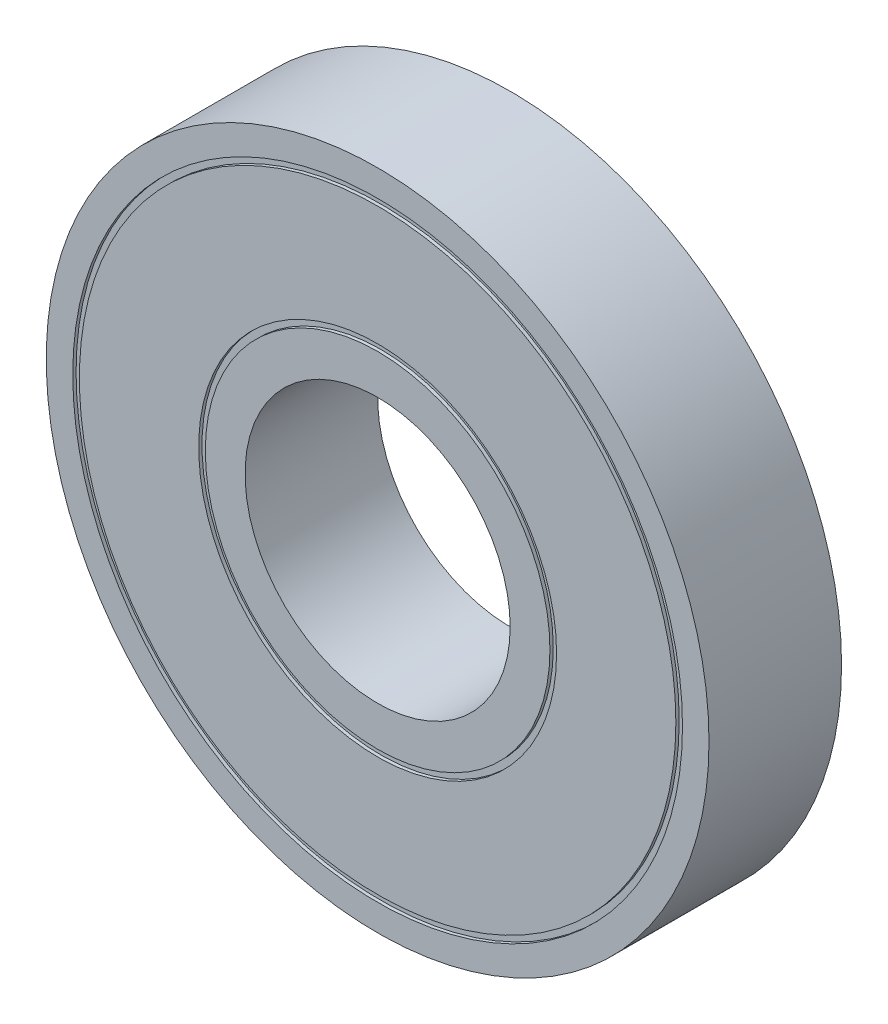
ISO-10303-21;
HEADER;
FILE_DESCRIPTION(('STEP AP214'),'2;1');
FILE_NAME('part.step','',(''),(''),'','','');
FILE_SCHEMA(('AUTOMOTIVE_DESIGN { 1 0 10303 214 1 1 1 1 }'));
ENDSEC;
DATA;
#1=APPLICATION_CONTEXT('core data for automotive mechanical design processes');
#2=APPLICATION_PROTOCOL_DEFINITION('international standard','automotive_design',2000,#1);
#3=PRODUCT_CONTEXT('',#1,'mechanical');
#4=PRODUCT('Part','Part','',(#3));
#5=PRODUCT_RELATED_PRODUCT_CATEGORY('part','',(#4));
#6=PRODUCT_DEFINITION_FORMATION('','',#4);
#7=PRODUCT_DEFINITION_CONTEXT('part definition',#1,'design');
#8=PRODUCT_DEFINITION('design','',#6,#7);
#9=PRODUCT_DEFINITION_SHAPE('','',#8);
#10=(LENGTH_UNIT() NAMED_UNIT(*) SI_UNIT(.MILLI.,.METRE.));
#11=(NAMED_UNIT(*) PLANE_ANGLE_UNIT() SI_UNIT($,.RADIAN.));
#12=(NAMED_UNIT(*) SI_UNIT($,.STERADIAN.) SOLID_ANGLE_UNIT());
#13=UNCERTAINTY_MEASURE_WITH_UNIT(LENGTH_MEASURE(1.E-05),#10,'distance_accuracy_value','');
#14=(GEOMETRIC_REPRESENTATION_CONTEXT(3) GLOBAL_UNCERTAINTY_ASSIGNED_CONTEXT((#13)) GLOBAL_UNIT_ASSIGNED_CONTEXT((#10,
#11,#12)) REPRESENTATION_CONTEXT('',''));
#15=CARTESIAN_POINT('',(0.,0.,0.));
#16=DIRECTION('',(0.,0.,1.));
#17=DIRECTION('',(1.,0.,0.));
#18=AXIS2_PLACEMENT_3D('',#15,#16,#17);
#19=CARTESIAN_POINT('',(0.,0.,-5.));
#20=DIRECTION('',(0.,0.,1.));
#21=DIRECTION('',(1.,0.,0.));
#22=AXIS2_PLACEMENT_3D('',#19,#20,#21);
#23=PLANE('',#22);
#24=CARTESIAN_POINT('',(0.,0.,-5.));
#25=DIRECTION('',(0.,0.,1.));
#26=DIRECTION('',(1.,0.,0.));
#27=AXIS2_PLACEMENT_3D('',#24,#25,#26);
#28=CIRCLE('',#27,10.);
#29=CARTESIAN_POINT('',(10.,0.,-5.));
#30=VERTEX_POINT('',#29);
#31=EDGE_CURVE('E66',#30,#30,#28,.T.);
#32=ORIENTED_EDGE('',*,*,#31,.T.);
#33=EDGE_LOOP('',(#32));
#34=FACE_BOUND('',#33,.T.);
#35=CARTESIAN_POINT('',(0.,0.,-5.));
#36=DIRECTION('',(0.,0.,1.));
#37=DIRECTION('',(1.,0.,0.));
#38=AXIS2_PLACEMENT_3D('',#35,#36,#37);
#39=CIRCLE('',#38,13.);
#40=CARTESIAN_POINT('',(13.,0.,-5.));
#41=VERTEX_POINT('',#40);
#42=EDGE_CURVE('E111',#41,#41,#39,.T.);
#43=ORIENTED_EDGE('',*,*,#42,.F.);
#44=EDGE_LOOP('',(#43));
#45=FACE_BOUND('',#44,.T.);
#46=ADVANCED_FACE('F51',(#34,#45),#23,.F.);
#47=CARTESIAN_POINT('',(0.,0.,5.));
#48=DIRECTION('',(0.,0.,1.));
#49=DIRECTION('',(1.,0.,0.));
#50=AXIS2_PLACEMENT_3D('',#47,#48,#49);
#51=PLANE('',#50);
#52=CARTESIAN_POINT('',(0.,0.,5.));
#53=DIRECTION('',(0.,0.,1.));
#54=DIRECTION('',(1.,0.,0.));
#55=AXIS2_PLACEMENT_3D('',#52,#53,#54);
#56=CIRCLE('',#55,10.);
#57=CARTESIAN_POINT('',(10.,0.,5.));
#58=VERTEX_POINT('',#57);
#59=EDGE_CURVE('E64',#58,#58,#56,.T.);
#60=ORIENTED_EDGE('',*,*,#59,.F.);
#61=EDGE_LOOP('',(#60));
#62=FACE_BOUND('',#61,.T.);
#63=CARTESIAN_POINT('',(0.,0.,5.));
#64=DIRECTION('',(0.,0.,1.));
#65=DIRECTION('',(1.,0.,0.));
#66=AXIS2_PLACEMENT_3D('',#63,#64,#65);
#67=CIRCLE('',#66,13.);
#68=CARTESIAN_POINT('',(13.,0.,5.));
#69=VERTEX_POINT('',#68);
#70=EDGE_CURVE('E79',#69,#69,#67,.T.);
#71=ORIENTED_EDGE('',*,*,#70,.T.);
#72=EDGE_LOOP('',(#71));
#73=FACE_BOUND('',#72,.T.);
#74=ADVANCED_FACE('F159',(#62,#73),#51,.T.);
#75=CARTESIAN_POINT('',(0.,0.,5.));
#76=DIRECTION('',(0.,0.,1.));
#77=DIRECTION('',(1.,0.,0.));
#78=AXIS2_PLACEMENT_3D('',#75,#76,#77);
#79=CIRCLE('',#78,23.);
#80=CARTESIAN_POINT('',(23.,0.,5.));
#81=VERTEX_POINT('',#80);
#82=EDGE_CURVE('E90',#81,#81,#79,.T.);
#83=ORIENTED_EDGE('',*,*,#82,.F.);
#84=EDGE_LOOP('',(#83));
#85=FACE_BOUND('',#84,.T.);
#86=CARTESIAN_POINT('',(0.,0.,5.));
#87=DIRECTION('',(0.,0.,1.));
#88=DIRECTION('',(1.,0.,0.));
#89=AXIS2_PLACEMENT_3D('',#86,#87,#88);
#90=CIRCLE('',#89,25.);
#91=CARTESIAN_POINT('',(25.,0.,5.));
#92=VERTEX_POINT('',#91);
#93=EDGE_CURVE('E11',#92,#92,#90,.T.);
#94=ORIENTED_EDGE('',*,*,#93,.T.);
#95=EDGE_LOOP('',(#94));
#96=FACE_BOUND('',#95,.T.);
#97=ADVANCED_FACE('F162',(#85,#96),#51,.T.);
#98=CARTESIAN_POINT('',(0.,0.,-5.));
#99=DIRECTION('',(0.,0.,1.));
#100=DIRECTION('',(1.,0.,0.));
#101=AXIS2_PLACEMENT_3D('',#98,#99,#100);
#102=CIRCLE('',#101,23.);
#103=CARTESIAN_POINT('',(23.,0.,-5.));
#104=VERTEX_POINT('',#103);
#105=EDGE_CURVE('E122',#104,#104,#102,.T.);
#106=ORIENTED_EDGE('',*,*,#105,.T.);
#107=EDGE_LOOP('',(#106));
#108=FACE_BOUND('',#107,.T.);
#109=CARTESIAN_POINT('',(0.,0.,-5.));
#110=DIRECTION('',(0.,0.,1.));
#111=DIRECTION('',(1.,0.,0.));
#112=AXIS2_PLACEMENT_3D('',#109,#110,#111);
#113=CIRCLE('',#112,25.);
#114=CARTESIAN_POINT('',(25.,0.,-5.));
#115=VERTEX_POINT('',#114);
#116=EDGE_CURVE('E55',#115,#115,#113,.T.);
#117=ORIENTED_EDGE('',*,*,#116,.F.);
#118=EDGE_LOOP('',(#117));
#119=FACE_BOUND('',#118,.T.);
#120=ADVANCED_FACE('F152',(#108,#119),#23,.F.);
#121=CARTESIAN_POINT('',(0.,0.,5.));
#122=DIRECTION('',(0.,0.,-1.));
#123=DIRECTION('',(-1.,0.,0.));
#124=AXIS2_PLACEMENT_3D('',#121,#122,#123);
#125=CYLINDRICAL_SURFACE('',#124,25.);
#126=ORIENTED_EDGE('',*,*,#93,.F.);
#127=EDGE_LOOP('',(#126));
#128=FACE_BOUND('',#127,.T.);
#129=ORIENTED_EDGE('',*,*,#116,.T.);
#130=EDGE_LOOP('',(#129));
#131=FACE_BOUND('',#130,.T.);
#132=ADVANCED_FACE('F53',(#128,#131),#125,.T.);
#133=CARTESIAN_POINT('',(0.,0.,5.));
#134=DIRECTION('',(0.,0.,-1.));
#135=DIRECTION('',(-1.,0.,0.));
#136=AXIS2_PLACEMENT_3D('',#133,#134,#135);
#137=CYLINDRICAL_SURFACE('',#136,10.);
#138=ORIENTED_EDGE('',*,*,#59,.T.);
#139=EDGE_LOOP('',(#138));
#140=FACE_BOUND('',#139,.T.);
#141=ORIENTED_EDGE('',*,*,#31,.F.);
#142=EDGE_LOOP('',(#141));
#143=FACE_BOUND('',#142,.T.);
#144=ADVANCED_FACE('F168',(#140,#143),#137,.F.);
#145=CARTESIAN_POINT('',(0.,0.,4.75));
#146=DIRECTION('',(0.,0.,1.));
#147=DIRECTION('',(1.,0.,0.));
#148=AXIS2_PLACEMENT_3D('',#145,#146,#147);
#149=CYLINDRICAL_SURFACE('',#148,13.);
#150=CARTESIAN_POINT('',(0.,0.,4.75));
#151=DIRECTION('',(0.,0.,1.));
#152=DIRECTION('',(1.,0.,0.));
#153=AXIS2_PLACEMENT_3D('',#150,#151,#152);
#154=CIRCLE('',#153,13.);
#155=CARTESIAN_POINT('',(13.,0.,4.75));
#156=VERTEX_POINT('',#155);
#157=EDGE_CURVE('E78',#156,#156,#154,.T.);
#158=ORIENTED_EDGE('',*,*,#157,.T.);
#159=EDGE_LOOP('',(#158));
#160=FACE_BOUND('',#159,.T.);
#161=ORIENTED_EDGE('',*,*,#70,.F.);
#162=EDGE_LOOP('',(#161));
#163=FACE_BOUND('',#162,.T.);
#164=ADVANCED_FACE('F213',(#160,#163),#149,.T.);
#165=CARTESIAN_POINT('',(0.,0.,4.75));
#166=DIRECTION('',(0.,0.,1.));
#167=DIRECTION('',(1.,0.,0.));
#168=AXIS2_PLACEMENT_3D('',#165,#166,#167);
#169=CYLINDRICAL_SURFACE('',#168,13.5);
#170=CARTESIAN_POINT('',(0.,0.,4.75));
#171=DIRECTION('',(0.,0.,1.));
#172=DIRECTION('',(1.,0.,0.));
#173=AXIS2_PLACEMENT_3D('',#170,#171,#172);
#174=CIRCLE('',#173,13.5);
#175=CARTESIAN_POINT('',(13.5,0.,4.75));
#176=VERTEX_POINT('',#175);
#177=EDGE_CURVE('E70',#176,#176,#174,.T.);
#178=ORIENTED_EDGE('',*,*,#177,.F.);
#179=EDGE_LOOP('',(#178));
#180=FACE_BOUND('',#179,.T.);
#181=CARTESIAN_POINT('',(0.,0.,5.));
#182=DIRECTION('',(0.,0.,1.));
#183=DIRECTION('',(1.,0.,0.));
#184=AXIS2_PLACEMENT_3D('',#181,#182,#183);
#185=CIRCLE('',#184,13.5);
#186=CARTESIAN_POINT('',(13.5,0.,5.));
#187=VERTEX_POINT('',#186);
#188=EDGE_CURVE('E74',#187,#187,#185,.T.);
#189=ORIENTED_EDGE('',*,*,#188,.T.);
#190=EDGE_LOOP('',(#189));
#191=FACE_BOUND('',#190,.T.);
#192=ADVANCED_FACE('F209',(#180,#191),#169,.F.);
#193=CARTESIAN_POINT('',(0.,0.,4.75));
#194=DIRECTION('',(0.,0.,1.));
#195=DIRECTION('',(1.,0.,0.));
#196=AXIS2_PLACEMENT_3D('',#193,#194,#195);
#197=PLANE('',#196);
#198=ORIENTED_EDGE('',*,*,#157,.F.);
#199=EDGE_LOOP('',(#198));
#200=FACE_BOUND('',#199,.T.);
#201=ORIENTED_EDGE('',*,*,#177,.T.);
#202=EDGE_LOOP('',(#201));
#203=FACE_BOUND('',#202,.T.);
#204=ADVANCED_FACE('F205',(#200,#203),#197,.T.);
#205=CARTESIAN_POINT('',(0.,0.,4.75));
#206=DIRECTION('',(0.,0.,1.));
#207=DIRECTION('',(1.,0.,0.));
#208=AXIS2_PLACEMENT_3D('',#205,#206,#207);
#209=CYLINDRICAL_SURFACE('',#208,22.5);
#210=CARTESIAN_POINT('',(0.,0.,4.75));
#211=DIRECTION('',(0.,0.,1.));
#212=DIRECTION('',(1.,0.,0.));
#213=AXIS2_PLACEMENT_3D('',#210,#211,#212);
#214=CIRCLE('',#213,22.5);
#215=CARTESIAN_POINT('',(22.5,0.,4.75));
#216=VERTEX_POINT('',#215);
#217=EDGE_CURVE('E94',#216,#216,#214,.T.);
#218=ORIENTED_EDGE('',*,*,#217,.T.);
#219=EDGE_LOOP('',(#218));
#220=FACE_BOUND('',#219,.T.);
#221=CARTESIAN_POINT('',(0.,0.,5.));
#222=DIRECTION('',(0.,0.,1.));
#223=DIRECTION('',(1.,0.,0.));
#224=AXIS2_PLACEMENT_3D('',#221,#222,#223);
#225=CIRCLE('',#224,22.5);
#226=CARTESIAN_POINT('',(22.5,0.,5.));
#227=VERTEX_POINT('',#226);
#228=EDGE_CURVE('E95',#227,#227,#225,.T.);
#229=ORIENTED_EDGE('',*,*,#228,.F.);
#230=EDGE_LOOP('',(#229));
#231=FACE_BOUND('',#230,.T.);
#232=ADVANCED_FACE('F201',(#220,#231),#209,.T.);
#233=CARTESIAN_POINT('',(0.,0.,4.75));
#234=DIRECTION('',(0.,0.,1.));
#235=DIRECTION('',(1.,0.,0.));
#236=AXIS2_PLACEMENT_3D('',#233,#234,#235);
#237=CYLINDRICAL_SURFACE('',#236,23.);
#238=CARTESIAN_POINT('',(0.,0.,4.75));
#239=DIRECTION('',(0.,0.,1.));
#240=DIRECTION('',(1.,0.,0.));
#241=AXIS2_PLACEMENT_3D('',#238,#239,#240);
#242=CIRCLE('',#241,23.);
#243=CARTESIAN_POINT('',(23.,0.,4.75));
#244=VERTEX_POINT('',#243);
#245=EDGE_CURVE('E83',#244,#244,#242,.T.);
#246=ORIENTED_EDGE('',*,*,#245,.F.);
#247=EDGE_LOOP('',(#246));
#248=FACE_BOUND('',#247,.T.);
#249=ORIENTED_EDGE('',*,*,#82,.T.);
#250=EDGE_LOOP('',(#249));
#251=FACE_BOUND('',#250,.T.);
#252=ADVANCED_FACE('F197',(#248,#251),#237,.F.);
#253=CARTESIAN_POINT('',(0.,0.,4.75));
#254=DIRECTION('',(0.,0.,1.));
#255=DIRECTION('',(1.,0.,0.));
#256=AXIS2_PLACEMENT_3D('',#253,#254,#255);
#257=PLANE('',#256);
#258=ORIENTED_EDGE('',*,*,#217,.F.);
#259=EDGE_LOOP('',(#258));
#260=FACE_BOUND('',#259,.T.);
#261=ORIENTED_EDGE('',*,*,#245,.T.);
#262=EDGE_LOOP('',(#261));
#263=FACE_BOUND('',#262,.T.);
#264=ADVANCED_FACE('F194',(#260,#263),#257,.T.);
#265=ORIENTED_EDGE('',*,*,#188,.F.);
#266=EDGE_LOOP('',(#265));
#267=FACE_BOUND('',#266,.T.);
#268=ORIENTED_EDGE('',*,*,#228,.T.);
#269=EDGE_LOOP('',(#268));
#270=FACE_BOUND('',#269,.T.);
#271=ADVANCED_FACE('F171',(#267,#270),#51,.T.);
#272=CARTESIAN_POINT('',(0.,0.,-4.75));
#273=DIRECTION('',(0.,0.,-1.));
#274=DIRECTION('',(-1.,0.,0.));
#275=AXIS2_PLACEMENT_3D('',#272,#273,#274);
#276=CYLINDRICAL_SURFACE('',#275,13.);
#277=CARTESIAN_POINT('',(0.,0.,-4.75));
#278=DIRECTION('',(0.,0.,1.));
#279=DIRECTION('',(1.,0.,0.));
#280=AXIS2_PLACEMENT_3D('',#277,#278,#279);
#281=CIRCLE('',#280,13.);
#282=CARTESIAN_POINT('',(13.,0.,-4.75));
#283=VERTEX_POINT('',#282);
#284=EDGE_CURVE('E110',#283,#283,#281,.T.);
#285=ORIENTED_EDGE('',*,*,#284,.F.);
#286=EDGE_LOOP('',(#285));
#287=FACE_BOUND('',#286,.T.);
#288=ORIENTED_EDGE('',*,*,#42,.T.);
#289=EDGE_LOOP('',(#288));
#290=FACE_BOUND('',#289,.T.);
#291=ADVANCED_FACE('F189',(#287,#290),#276,.T.);
#292=CARTESIAN_POINT('',(0.,0.,-4.75));
#293=DIRECTION('',(0.,0.,-1.));
#294=DIRECTION('',(-1.,0.,0.));
#295=AXIS2_PLACEMENT_3D('',#292,#293,#294);
#296=CYLINDRICAL_SURFACE('',#295,13.5);
#297=CARTESIAN_POINT('',(0.,0.,-4.75));
#298=DIRECTION('',(0.,0.,1.));
#299=DIRECTION('',(1.,0.,0.));
#300=AXIS2_PLACEMENT_3D('',#297,#298,#299);
#301=CIRCLE('',#300,13.5);
#302=CARTESIAN_POINT('',(13.5,0.,-4.75));
#303=VERTEX_POINT('',#302);
#304=EDGE_CURVE('E99',#303,#303,#301,.T.);
#305=ORIENTED_EDGE('',*,*,#304,.T.);
#306=EDGE_LOOP('',(#305));
#307=FACE_BOUND('',#306,.T.);
#308=CARTESIAN_POINT('',(0.,0.,-5.));
#309=DIRECTION('',(0.,0.,1.));
#310=DIRECTION('',(1.,0.,0.));
#311=AXIS2_PLACEMENT_3D('',#308,#309,#310);
#312=CIRCLE('',#311,13.5);
#313=CARTESIAN_POINT('',(13.5,0.,-5.));
#314=VERTEX_POINT('',#313);
#315=EDGE_CURVE('E106',#314,#314,#312,.T.);
#316=ORIENTED_EDGE('',*,*,#315,.F.);
#317=EDGE_LOOP('',(#316));
#318=FACE_BOUND('',#317,.T.);
#319=ADVANCED_FACE('F185',(#307,#318),#296,.F.);
#320=CARTESIAN_POINT('',(0.,0.,-4.75));
#321=DIRECTION('',(0.,0.,-1.));
#322=DIRECTION('',(1.,0.,0.));
#323=AXIS2_PLACEMENT_3D('',#320,#321,#322);
#324=PLANE('',#323);
#325=ORIENTED_EDGE('',*,*,#284,.T.);
#326=EDGE_LOOP('',(#325));
#327=FACE_BOUND('',#326,.T.);
#328=ORIENTED_EDGE('',*,*,#304,.F.);
#329=EDGE_LOOP('',(#328));
#330=FACE_BOUND('',#329,.T.);
#331=ADVANCED_FACE('F145',(#327,#330),#324,.T.);
#332=CARTESIAN_POINT('',(0.,0.,-4.75));
#333=DIRECTION('',(0.,0.,-1.));
#334=DIRECTION('',(-1.,0.,0.));
#335=AXIS2_PLACEMENT_3D('',#332,#333,#334);
#336=CYLINDRICAL_SURFACE('',#335,22.5);
#337=CARTESIAN_POINT('',(0.,0.,-4.75));
#338=DIRECTION('',(0.,0.,1.));
#339=DIRECTION('',(1.,0.,0.));
#340=AXIS2_PLACEMENT_3D('',#337,#338,#339);
#341=CIRCLE('',#340,22.5);
#342=CARTESIAN_POINT('',(22.5,0.,-4.75));
#343=VERTEX_POINT('',#342);
#344=EDGE_CURVE('E126',#343,#343,#341,.T.);
#345=ORIENTED_EDGE('',*,*,#344,.F.);
#346=EDGE_LOOP('',(#345));
#347=FACE_BOUND('',#346,.T.);
#348=CARTESIAN_POINT('',(0.,0.,-5.));
#349=DIRECTION('',(0.,0.,1.));
#350=DIRECTION('',(1.,0.,0.));
#351=AXIS2_PLACEMENT_3D('',#348,#349,#350);
#352=CIRCLE('',#351,22.5);
#353=CARTESIAN_POINT('',(22.5,0.,-5.));
#354=VERTEX_POINT('',#353);
#355=EDGE_CURVE('E127',#354,#354,#352,.T.);
#356=ORIENTED_EDGE('',*,*,#355,.T.);
#357=EDGE_LOOP('',(#356));
#358=FACE_BOUND('',#357,.T.);
#359=ADVANCED_FACE('F141',(#347,#358),#336,.T.);
#360=CARTESIAN_POINT('',(0.,0.,-4.75));
#361=DIRECTION('',(0.,0.,-1.));
#362=DIRECTION('',(-1.,0.,0.));
#363=AXIS2_PLACEMENT_3D('',#360,#361,#362);
#364=CYLINDRICAL_SURFACE('',#363,23.);
#365=CARTESIAN_POINT('',(0.,0.,-4.75));
#366=DIRECTION('',(0.,0.,1.));
#367=DIRECTION('',(1.,0.,0.));
#368=AXIS2_PLACEMENT_3D('',#365,#366,#367);
#369=CIRCLE('',#368,23.);
#370=CARTESIAN_POINT('',(23.,0.,-4.75));
#371=VERTEX_POINT('',#370);
#372=EDGE_CURVE('E115',#371,#371,#369,.T.);
#373=ORIENTED_EDGE('',*,*,#372,.T.);
#374=EDGE_LOOP('',(#373));
#375=FACE_BOUND('',#374,.T.);
#376=ORIENTED_EDGE('',*,*,#105,.F.);
#377=EDGE_LOOP('',(#376));
#378=FACE_BOUND('',#377,.T.);
#379=ADVANCED_FACE('F144',(#375,#378),#364,.F.);
#380=CARTESIAN_POINT('',(0.,0.,-4.75));
#381=DIRECTION('',(0.,0.,-1.));
#382=DIRECTION('',(1.,0.,0.));
#383=AXIS2_PLACEMENT_3D('',#380,#381,#382);
#384=PLANE('',#383);
#385=ORIENTED_EDGE('',*,*,#344,.T.);
#386=EDGE_LOOP('',(#385));
#387=FACE_BOUND('',#386,.T.);
#388=ORIENTED_EDGE('',*,*,#372,.F.);
#389=EDGE_LOOP('',(#388));
#390=FACE_BOUND('',#389,.T.);
#391=ADVANCED_FACE('F138',(#387,#390),#384,.T.);
#392=ORIENTED_EDGE('',*,*,#315,.T.);
#393=EDGE_LOOP('',(#392));
#394=FACE_BOUND('',#393,.T.);
#395=ORIENTED_EDGE('',*,*,#355,.F.);
#396=EDGE_LOOP('',(#395));
#397=FACE_BOUND('',#396,.T.);
#398=ADVANCED_FACE('F149',(#394,#397),#23,.F.);
#399=CLOSED_SHELL('',(#46,#74,#97,#120,#132,#144,#164,#192,#204,#232,#252,#264,#271,#291,#319,
#331,#359,#379,#391,#398));
#400=MANIFOLD_SOLID_BREP('B2',#399);
#401=ADVANCED_BREP_SHAPE_REPRESENTATION('',(#18,#400),#14);
#402=SHAPE_DEFINITION_REPRESENTATION(#9,#401);
ENDSEC;
END-ISO-10303-21;
